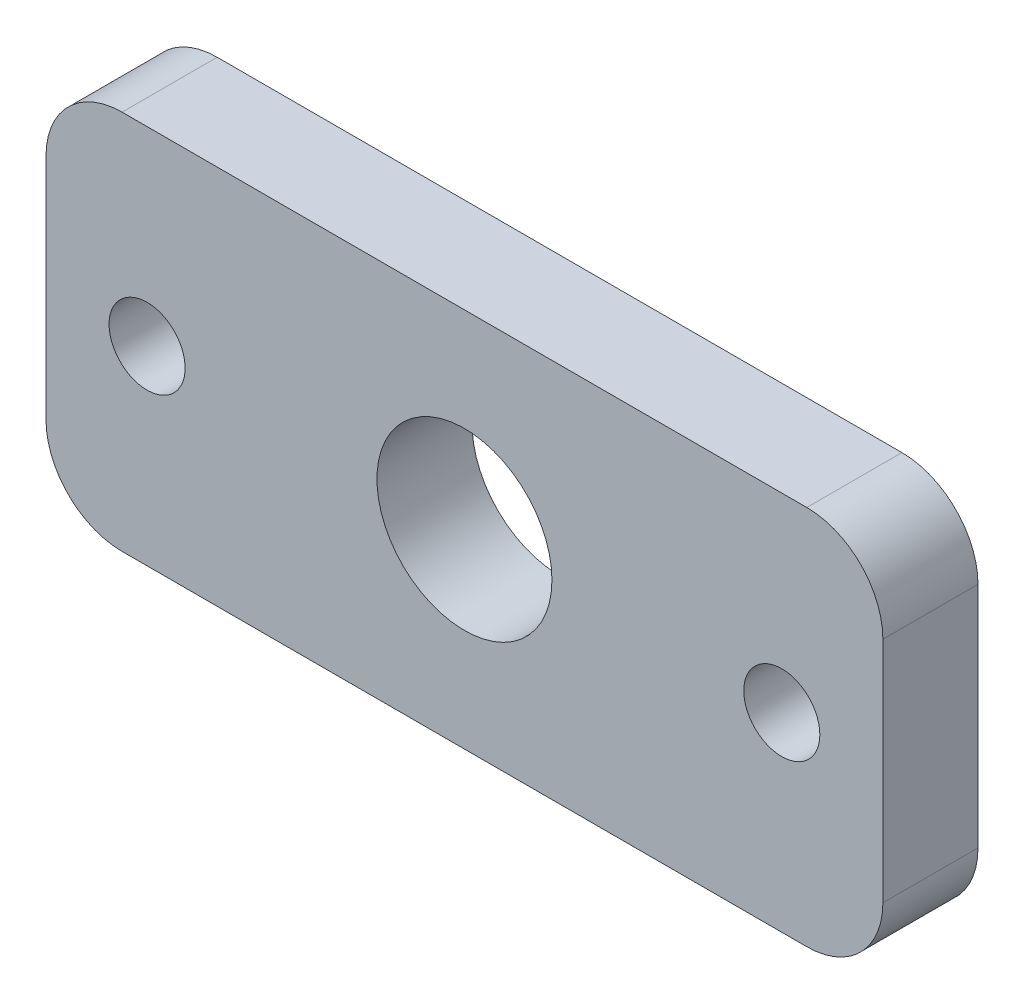
ISO-10303-21;
HEADER;
FILE_DESCRIPTION(('STEP AP214'),'2;1');
FILE_NAME('part.step','',(''),(''),'','','');
FILE_SCHEMA(('AUTOMOTIVE_DESIGN { 1 0 10303 214 1 1 1 1 }'));
ENDSEC;
DATA;
#1=APPLICATION_CONTEXT('core data for automotive mechanical design processes');
#2=APPLICATION_PROTOCOL_DEFINITION('international standard','automotive_design',2000,#1);
#3=PRODUCT_CONTEXT('',#1,'mechanical');
#4=PRODUCT('Part','Part','',(#3));
#5=PRODUCT_RELATED_PRODUCT_CATEGORY('part','',(#4));
#6=PRODUCT_DEFINITION_FORMATION('','',#4);
#7=PRODUCT_DEFINITION_CONTEXT('part definition',#1,'design');
#8=PRODUCT_DEFINITION('design','',#6,#7);
#9=PRODUCT_DEFINITION_SHAPE('','',#8);
#10=(LENGTH_UNIT() NAMED_UNIT(*) SI_UNIT(.MILLI.,.METRE.));
#11=(NAMED_UNIT(*) PLANE_ANGLE_UNIT() SI_UNIT($,.RADIAN.));
#12=(NAMED_UNIT(*) SI_UNIT($,.STERADIAN.) SOLID_ANGLE_UNIT());
#13=UNCERTAINTY_MEASURE_WITH_UNIT(LENGTH_MEASURE(1.E-05),#10,'distance_accuracy_value','');
#14=(GEOMETRIC_REPRESENTATION_CONTEXT(3) GLOBAL_UNCERTAINTY_ASSIGNED_CONTEXT((#13)) GLOBAL_UNIT_ASSIGNED_CONTEXT((#10,
#11,#12)) REPRESENTATION_CONTEXT('',''));
#15=CARTESIAN_POINT('',(0.,0.,0.));
#16=DIRECTION('',(0.,0.,1.));
#17=DIRECTION('',(1.,0.,0.));
#18=AXIS2_PLACEMENT_3D('',#15,#16,#17);
#19=CARTESIAN_POINT('',(0.,0.,3.175));
#20=DIRECTION('',(0.,0.,1.));
#21=DIRECTION('',(1.,0.,0.));
#22=AXIS2_PLACEMENT_3D('',#19,#20,#21);
#23=PLANE('',#22);
#24=CARTESIAN_POINT('',(-21.19,0.,3.175));
#25=DIRECTION('',(0.,0.,1.));
#26=DIRECTION('',(-1.,0.,0.));
#27=AXIS2_PLACEMENT_3D('',#24,#25,#26);
#28=CIRCLE('',#27,2.54);
#29=CARTESIAN_POINT('',(-23.73,0.,3.175));
#30=VERTEX_POINT('',#29);
#31=EDGE_CURVE('E184',#30,#30,#28,.T.);
#32=ORIENTED_EDGE('',*,*,#31,.F.);
#33=EDGE_LOOP('',(#32));
#34=FACE_BOUND('',#33,.T.);
#35=CARTESIAN_POINT('',(21.19,0.,3.175));
#36=DIRECTION('',(0.,0.,1.));
#37=DIRECTION('',(1.,0.,0.));
#38=AXIS2_PLACEMENT_3D('',#35,#36,#37);
#39=CIRCLE('',#38,2.54);
#40=CARTESIAN_POINT('',(23.73,0.,3.175));
#41=VERTEX_POINT('',#40);
#42=EDGE_CURVE('E178',#41,#41,#39,.T.);
#43=ORIENTED_EDGE('',*,*,#42,.F.);
#44=EDGE_LOOP('',(#43));
#45=FACE_BOUND('',#44,.T.);
#46=DIRECTION('',(0.,-1.,0.));
#47=VECTOR('',#46,1.);
#48=CARTESIAN_POINT('',(-27.94,12.7,3.175));
#49=LINE('',#48,#47);
#50=CARTESIAN_POINT('',(-27.94,7.62,3.175));
#51=VERTEX_POINT('',#50);
#52=CARTESIAN_POINT('',(-27.94,-7.62,3.175));
#53=VERTEX_POINT('',#52);
#54=EDGE_CURVE('E171',#51,#53,#49,.T.);
#55=ORIENTED_EDGE('',*,*,#54,.T.);
#56=CARTESIAN_POINT('',(-22.86,-7.62,3.175));
#57=DIRECTION('',(0.,0.,1.));
#58=DIRECTION('',(1.,0.,0.));
#59=AXIS2_PLACEMENT_3D('',#56,#57,#58);
#60=CIRCLE('',#59,5.08);
#61=CARTESIAN_POINT('',(-22.86,-12.7,3.175));
#62=VERTEX_POINT('',#61);
#63=EDGE_CURVE('E148',#53,#62,#60,.T.);
#64=ORIENTED_EDGE('',*,*,#63,.T.);
#65=DIRECTION('',(1.,0.,0.));
#66=VECTOR('',#65,1.);
#67=CARTESIAN_POINT('',(-27.94,-12.7,3.175));
#68=LINE('',#67,#66);
#69=CARTESIAN_POINT('',(22.86,-12.7,3.175));
#70=VERTEX_POINT('',#69);
#71=EDGE_CURVE('E119',#62,#70,#68,.T.);
#72=ORIENTED_EDGE('',*,*,#71,.T.);
#73=CARTESIAN_POINT('',(22.86,-7.62,3.175));
#74=DIRECTION('',(0.,0.,1.));
#75=DIRECTION('',(1.,0.,0.));
#76=AXIS2_PLACEMENT_3D('',#73,#74,#75);
#77=CIRCLE('',#76,5.08);
#78=CARTESIAN_POINT('',(27.94,-7.62,3.175));
#79=VERTEX_POINT('',#78);
#80=EDGE_CURVE('E146',#70,#79,#77,.T.);
#81=ORIENTED_EDGE('',*,*,#80,.T.);
#82=DIRECTION('',(0.,1.,0.));
#83=VECTOR('',#82,1.);
#84=CARTESIAN_POINT('',(27.94,12.7,3.175));
#85=LINE('',#84,#83);
#86=CARTESIAN_POINT('',(27.94,7.62,3.175));
#87=VERTEX_POINT('',#86);
#88=EDGE_CURVE('E126',#79,#87,#85,.T.);
#89=ORIENTED_EDGE('',*,*,#88,.T.);
#90=CARTESIAN_POINT('',(22.86,7.62,3.175));
#91=DIRECTION('',(0.,0.,1.));
#92=DIRECTION('',(1.,0.,0.));
#93=AXIS2_PLACEMENT_3D('',#90,#91,#92);
#94=CIRCLE('',#93,5.08);
#95=CARTESIAN_POINT('',(22.86,12.7,3.175));
#96=VERTEX_POINT('',#95);
#97=EDGE_CURVE('E54',#87,#96,#94,.T.);
#98=ORIENTED_EDGE('',*,*,#97,.T.);
#99=DIRECTION('',(-1.,0.,0.));
#100=VECTOR('',#99,1.);
#101=CARTESIAN_POINT('',(-27.94,12.7,3.175));
#102=LINE('',#101,#100);
#103=CARTESIAN_POINT('',(-22.86,12.7,3.175));
#104=VERTEX_POINT('',#103);
#105=EDGE_CURVE('E129',#96,#104,#102,.T.);
#106=ORIENTED_EDGE('',*,*,#105,.T.);
#107=CARTESIAN_POINT('',(-22.86,7.62,3.175));
#108=DIRECTION('',(0.,0.,1.));
#109=DIRECTION('',(1.,0.,0.));
#110=AXIS2_PLACEMENT_3D('',#107,#108,#109);
#111=CIRCLE('',#110,5.08);
#112=EDGE_CURVE('E143',#104,#51,#111,.T.);
#113=ORIENTED_EDGE('',*,*,#112,.T.);
#114=EDGE_LOOP('',(#55,#64,#72,#81,#89,#98,#106,#113));
#115=FACE_BOUND('',#114,.T.);
#116=CARTESIAN_POINT('',(0.,0.,3.175));
#117=DIRECTION('',(0.,0.,1.));
#118=DIRECTION('',(1.,0.,0.));
#119=AXIS2_PLACEMENT_3D('',#116,#117,#118);
#120=CIRCLE('',#119,5.842);
#121=CARTESIAN_POINT('',(5.842,0.,3.175));
#122=VERTEX_POINT('',#121);
#123=EDGE_CURVE('E164',#122,#122,#120,.T.);
#124=ORIENTED_EDGE('',*,*,#123,.F.);
#125=EDGE_LOOP('',(#124));
#126=FACE_BOUND('',#125,.T.);
#127=ADVANCED_FACE('F33',(#34,#45,#115,#126),#23,.T.);
#128=CARTESIAN_POINT('',(0.,0.,-3.175));
#129=DIRECTION('',(0.,0.,1.));
#130=DIRECTION('',(1.,0.,0.));
#131=AXIS2_PLACEMENT_3D('',#128,#129,#130);
#132=PLANE('',#131);
#133=CARTESIAN_POINT('',(-21.19,0.,-3.175));
#134=DIRECTION('',(0.,0.,1.));
#135=DIRECTION('',(-1.,0.,0.));
#136=AXIS2_PLACEMENT_3D('',#133,#134,#135);
#137=CIRCLE('',#136,2.54);
#138=CARTESIAN_POINT('',(-23.73,0.,-3.175));
#139=VERTEX_POINT('',#138);
#140=EDGE_CURVE('E181',#139,#139,#137,.T.);
#141=ORIENTED_EDGE('',*,*,#140,.T.);
#142=EDGE_LOOP('',(#141));
#143=FACE_BOUND('',#142,.T.);
#144=CARTESIAN_POINT('',(21.19,0.,-3.175));
#145=DIRECTION('',(0.,0.,1.));
#146=DIRECTION('',(1.,0.,0.));
#147=AXIS2_PLACEMENT_3D('',#144,#145,#146);
#148=CIRCLE('',#147,2.54);
#149=CARTESIAN_POINT('',(23.73,0.,-3.175));
#150=VERTEX_POINT('',#149);
#151=EDGE_CURVE('E176',#150,#150,#148,.T.);
#152=ORIENTED_EDGE('',*,*,#151,.T.);
#153=EDGE_LOOP('',(#152));
#154=FACE_BOUND('',#153,.T.);
#155=DIRECTION('',(1.,0.,0.));
#156=VECTOR('',#155,1.);
#157=CARTESIAN_POINT('',(-27.94,-12.7,-3.175));
#158=LINE('',#157,#156);
#159=CARTESIAN_POINT('',(-22.86,-12.7,-3.175));
#160=VERTEX_POINT('',#159);
#161=CARTESIAN_POINT('',(22.86,-12.7,-3.175));
#162=VERTEX_POINT('',#161);
#163=EDGE_CURVE('E116',#160,#162,#158,.T.);
#164=ORIENTED_EDGE('',*,*,#163,.F.);
#165=CARTESIAN_POINT('',(-22.86,-7.62,-3.175));
#166=DIRECTION('',(0.,0.,1.));
#167=DIRECTION('',(1.,0.,0.));
#168=AXIS2_PLACEMENT_3D('',#165,#166,#167);
#169=CIRCLE('',#168,5.08);
#170=CARTESIAN_POINT('',(-27.94,-7.62,-3.175));
#171=VERTEX_POINT('',#170);
#172=EDGE_CURVE('E99',#160,#171,#169,.F.);
#173=ORIENTED_EDGE('',*,*,#172,.T.);
#174=DIRECTION('',(0.,-1.,0.));
#175=VECTOR('',#174,1.);
#176=CARTESIAN_POINT('',(-27.94,12.7,-3.175));
#177=LINE('',#176,#175);
#178=CARTESIAN_POINT('',(-27.94,7.62,-3.175));
#179=VERTEX_POINT('',#178);
#180=EDGE_CURVE('E127',#179,#171,#177,.T.);
#181=ORIENTED_EDGE('',*,*,#180,.F.);
#182=CARTESIAN_POINT('',(-22.86,7.62,-3.175));
#183=DIRECTION('',(0.,0.,1.));
#184=DIRECTION('',(1.,0.,0.));
#185=AXIS2_PLACEMENT_3D('',#182,#183,#184);
#186=CIRCLE('',#185,5.08);
#187=CARTESIAN_POINT('',(-22.86,12.7,-3.175));
#188=VERTEX_POINT('',#187);
#189=EDGE_CURVE('E120',#179,#188,#186,.F.);
#190=ORIENTED_EDGE('',*,*,#189,.T.);
#191=DIRECTION('',(-1.,0.,0.));
#192=VECTOR('',#191,1.);
#193=CARTESIAN_POINT('',(-27.94,12.7,-3.175));
#194=LINE('',#193,#192);
#195=CARTESIAN_POINT('',(22.86,12.7,-3.175));
#196=VERTEX_POINT('',#195);
#197=EDGE_CURVE('E131',#196,#188,#194,.T.);
#198=ORIENTED_EDGE('',*,*,#197,.F.);
#199=CARTESIAN_POINT('',(22.86,7.62,-3.175));
#200=DIRECTION('',(0.,0.,1.));
#201=DIRECTION('',(1.,0.,0.));
#202=AXIS2_PLACEMENT_3D('',#199,#200,#201);
#203=CIRCLE('',#202,5.08);
#204=CARTESIAN_POINT('',(27.94,7.62,-3.175));
#205=VERTEX_POINT('',#204);
#206=EDGE_CURVE('E137',#196,#205,#203,.F.);
#207=ORIENTED_EDGE('',*,*,#206,.T.);
#208=DIRECTION('',(0.,1.,0.));
#209=VECTOR('',#208,1.);
#210=CARTESIAN_POINT('',(27.94,12.7,-3.175));
#211=LINE('',#210,#209);
#212=CARTESIAN_POINT('',(27.94,-7.62,-3.175));
#213=VERTEX_POINT('',#212);
#214=EDGE_CURVE('E159',#213,#205,#211,.T.);
#215=ORIENTED_EDGE('',*,*,#214,.F.);
#216=CARTESIAN_POINT('',(22.86,-7.62,-3.175));
#217=DIRECTION('',(0.,0.,1.));
#218=DIRECTION('',(1.,0.,0.));
#219=AXIS2_PLACEMENT_3D('',#216,#217,#218);
#220=CIRCLE('',#219,5.08);
#221=EDGE_CURVE('E110',#213,#162,#220,.F.);
#222=ORIENTED_EDGE('',*,*,#221,.T.);
#223=EDGE_LOOP('',(#164,#173,#181,#190,#198,#207,#215,#222));
#224=FACE_BOUND('',#223,.T.);
#225=CARTESIAN_POINT('',(0.,0.,-3.175));
#226=DIRECTION('',(0.,0.,1.));
#227=DIRECTION('',(1.,0.,0.));
#228=AXIS2_PLACEMENT_3D('',#225,#226,#227);
#229=CIRCLE('',#228,5.842);
#230=CARTESIAN_POINT('',(5.842,0.,-3.175));
#231=VERTEX_POINT('',#230);
#232=EDGE_CURVE('E167',#231,#231,#229,.T.);
#233=ORIENTED_EDGE('',*,*,#232,.T.);
#234=EDGE_LOOP('',(#233));
#235=FACE_BOUND('',#234,.T.);
#236=ADVANCED_FACE('F123',(#143,#154,#224,#235),#132,.F.);
#237=CARTESIAN_POINT('',(27.94,12.7,3.175));
#238=DIRECTION('',(-1.,0.,0.));
#239=DIRECTION('',(0.,-1.,0.));
#240=AXIS2_PLACEMENT_3D('',#237,#238,#239);
#241=PLANE('',#240);
#242=ORIENTED_EDGE('',*,*,#88,.F.);
#243=DIRECTION('',(0.,0.,-1.));
#244=VECTOR('',#243,1.);
#245=CARTESIAN_POINT('',(27.94,-7.62,3.175));
#246=LINE('',#245,#244);
#247=EDGE_CURVE('E152',#79,#213,#246,.T.);
#248=ORIENTED_EDGE('',*,*,#247,.T.);
#249=ORIENTED_EDGE('',*,*,#214,.T.);
#250=DIRECTION('',(0.,0.,-1.));
#251=VECTOR('',#250,1.);
#252=CARTESIAN_POINT('',(27.94,7.62,3.175));
#253=LINE('',#252,#251);
#254=EDGE_CURVE('E150',#205,#87,#253,.F.);
#255=ORIENTED_EDGE('',*,*,#254,.T.);
#256=EDGE_LOOP('',(#242,#248,#249,#255));
#257=FACE_BOUND('',#256,.T.);
#258=ADVANCED_FACE('F158',(#257),#241,.F.);
#259=CARTESIAN_POINT('',(-27.94,12.7,3.175));
#260=DIRECTION('',(0.,-1.,0.));
#261=DIRECTION('',(0.,0.,-1.));
#262=AXIS2_PLACEMENT_3D('',#259,#260,#261);
#263=PLANE('',#262);
#264=ORIENTED_EDGE('',*,*,#105,.F.);
#265=DIRECTION('',(0.,0.,-1.));
#266=VECTOR('',#265,1.);
#267=CARTESIAN_POINT('',(22.86,12.7,3.175));
#268=LINE('',#267,#266);
#269=EDGE_CURVE('E11',#96,#196,#268,.T.);
#270=ORIENTED_EDGE('',*,*,#269,.T.);
#271=ORIENTED_EDGE('',*,*,#197,.T.);
#272=DIRECTION('',(0.,0.,-1.));
#273=VECTOR('',#272,1.);
#274=CARTESIAN_POINT('',(-22.86,12.7,3.175));
#275=LINE('',#274,#273);
#276=EDGE_CURVE('E41',#188,#104,#275,.F.);
#277=ORIENTED_EDGE('',*,*,#276,.T.);
#278=EDGE_LOOP('',(#264,#270,#271,#277));
#279=FACE_BOUND('',#278,.T.);
#280=ADVANCED_FACE('F217',(#279),#263,.F.);
#281=CARTESIAN_POINT('',(-27.94,12.7,3.175));
#282=DIRECTION('',(1.,0.,0.));
#283=DIRECTION('',(0.,1.,0.));
#284=AXIS2_PLACEMENT_3D('',#281,#282,#283);
#285=PLANE('',#284);
#286=ORIENTED_EDGE('',*,*,#180,.T.);
#287=DIRECTION('',(0.,0.,-1.));
#288=VECTOR('',#287,1.);
#289=CARTESIAN_POINT('',(-27.94,-7.62,3.175));
#290=LINE('',#289,#288);
#291=EDGE_CURVE('E104',#171,#53,#290,.F.);
#292=ORIENTED_EDGE('',*,*,#291,.T.);
#293=ORIENTED_EDGE('',*,*,#54,.F.);
#294=DIRECTION('',(0.,0.,-1.));
#295=VECTOR('',#294,1.);
#296=CARTESIAN_POINT('',(-27.94,7.62,3.175));
#297=LINE('',#296,#295);
#298=EDGE_CURVE('E109',#51,#179,#297,.T.);
#299=ORIENTED_EDGE('',*,*,#298,.T.);
#300=EDGE_LOOP('',(#286,#292,#293,#299));
#301=FACE_BOUND('',#300,.T.);
#302=ADVANCED_FACE('F222',(#301),#285,.F.);
#303=CARTESIAN_POINT('',(-27.94,-12.7,3.175));
#304=DIRECTION('',(0.,1.,0.));
#305=DIRECTION('',(0.,0.,1.));
#306=AXIS2_PLACEMENT_3D('',#303,#304,#305);
#307=PLANE('',#306);
#308=ORIENTED_EDGE('',*,*,#71,.F.);
#309=DIRECTION('',(0.,0.,-1.));
#310=VECTOR('',#309,1.);
#311=CARTESIAN_POINT('',(-22.86,-12.7,3.175));
#312=LINE('',#311,#310);
#313=EDGE_CURVE('E103',#62,#160,#312,.T.);
#314=ORIENTED_EDGE('',*,*,#313,.T.);
#315=ORIENTED_EDGE('',*,*,#163,.T.);
#316=DIRECTION('',(0.,0.,-1.));
#317=VECTOR('',#316,1.);
#318=CARTESIAN_POINT('',(22.86,-12.7,3.175));
#319=LINE('',#318,#317);
#320=EDGE_CURVE('E121',#162,#70,#319,.F.);
#321=ORIENTED_EDGE('',*,*,#320,.T.);
#322=EDGE_LOOP('',(#308,#314,#315,#321));
#323=FACE_BOUND('',#322,.T.);
#324=ADVANCED_FACE('F115',(#323),#307,.F.);
#325=CARTESIAN_POINT('',(0.,0.,3.175));
#326=DIRECTION('',(0.,0.,-1.));
#327=DIRECTION('',(-1.,0.,0.));
#328=AXIS2_PLACEMENT_3D('',#325,#326,#327);
#329=CYLINDRICAL_SURFACE('',#328,5.842);
#330=ORIENTED_EDGE('',*,*,#123,.T.);
#331=EDGE_LOOP('',(#330));
#332=FACE_BOUND('',#331,.T.);
#333=ORIENTED_EDGE('',*,*,#232,.F.);
#334=EDGE_LOOP('',(#333));
#335=FACE_BOUND('',#334,.T.);
#336=ADVANCED_FACE('F207',(#332,#335),#329,.F.);
#337=CARTESIAN_POINT('',(21.19,0.,-3.175));
#338=DIRECTION('',(0.,0.,1.));
#339=DIRECTION('',(1.,0.,0.));
#340=AXIS2_PLACEMENT_3D('',#337,#338,#339);
#341=CYLINDRICAL_SURFACE('',#340,2.54);
#342=ORIENTED_EDGE('',*,*,#151,.F.);
#343=EDGE_LOOP('',(#342));
#344=FACE_BOUND('',#343,.T.);
#345=ORIENTED_EDGE('',*,*,#42,.T.);
#346=EDGE_LOOP('',(#345));
#347=FACE_BOUND('',#346,.T.);
#348=ADVANCED_FACE('F195',(#344,#347),#341,.F.);
#349=CARTESIAN_POINT('',(-21.19,0.,-3.175));
#350=DIRECTION('',(0.,0.,1.));
#351=DIRECTION('',(1.,0.,0.));
#352=AXIS2_PLACEMENT_3D('',#349,#350,#351);
#353=CYLINDRICAL_SURFACE('',#352,2.54);
#354=ORIENTED_EDGE('',*,*,#140,.F.);
#355=EDGE_LOOP('',(#354));
#356=FACE_BOUND('',#355,.T.);
#357=ORIENTED_EDGE('',*,*,#31,.T.);
#358=EDGE_LOOP('',(#357));
#359=FACE_BOUND('',#358,.T.);
#360=ADVANCED_FACE('F192',(#356,#359),#353,.F.);
#361=CARTESIAN_POINT('',(-22.86,-7.62,3.175));
#362=DIRECTION('',(0.,0.,-1.));
#363=DIRECTION('',(-1.,0.,0.));
#364=AXIS2_PLACEMENT_3D('',#361,#362,#363);
#365=CYLINDRICAL_SURFACE('',#364,5.08);
#366=ORIENTED_EDGE('',*,*,#63,.F.);
#367=ORIENTED_EDGE('',*,*,#291,.F.);
#368=ORIENTED_EDGE('',*,*,#172,.F.);
#369=ORIENTED_EDGE('',*,*,#313,.F.);
#370=EDGE_LOOP('',(#366,#367,#368,#369));
#371=FACE_BOUND('',#370,.T.);
#372=ADVANCED_FACE('F102',(#371),#365,.T.);
#373=CARTESIAN_POINT('',(22.86,-7.62,3.175));
#374=DIRECTION('',(0.,0.,-1.));
#375=DIRECTION('',(-1.,0.,0.));
#376=AXIS2_PLACEMENT_3D('',#373,#374,#375);
#377=CYLINDRICAL_SURFACE('',#376,5.08);
#378=ORIENTED_EDGE('',*,*,#80,.F.);
#379=ORIENTED_EDGE('',*,*,#320,.F.);
#380=ORIENTED_EDGE('',*,*,#221,.F.);
#381=ORIENTED_EDGE('',*,*,#247,.F.);
#382=EDGE_LOOP('',(#378,#379,#380,#381));
#383=FACE_BOUND('',#382,.T.);
#384=ADVANCED_FACE('F230',(#383),#377,.T.);
#385=CARTESIAN_POINT('',(22.86,7.62,3.175));
#386=DIRECTION('',(0.,0.,-1.));
#387=DIRECTION('',(-1.,0.,0.));
#388=AXIS2_PLACEMENT_3D('',#385,#386,#387);
#389=CYLINDRICAL_SURFACE('',#388,5.08);
#390=ORIENTED_EDGE('',*,*,#97,.F.);
#391=ORIENTED_EDGE('',*,*,#254,.F.);
#392=ORIENTED_EDGE('',*,*,#206,.F.);
#393=ORIENTED_EDGE('',*,*,#269,.F.);
#394=EDGE_LOOP('',(#390,#391,#392,#393));
#395=FACE_BOUND('',#394,.T.);
#396=ADVANCED_FACE('F232',(#395),#389,.T.);
#397=CARTESIAN_POINT('',(-22.86,7.62,3.175));
#398=DIRECTION('',(0.,0.,-1.));
#399=DIRECTION('',(-1.,0.,0.));
#400=AXIS2_PLACEMENT_3D('',#397,#398,#399);
#401=CYLINDRICAL_SURFACE('',#400,5.08);
#402=ORIENTED_EDGE('',*,*,#112,.F.);
#403=ORIENTED_EDGE('',*,*,#276,.F.);
#404=ORIENTED_EDGE('',*,*,#189,.F.);
#405=ORIENTED_EDGE('',*,*,#298,.F.);
#406=EDGE_LOOP('',(#402,#403,#404,#405));
#407=FACE_BOUND('',#406,.T.);
#408=ADVANCED_FACE('F35',(#407),#401,.T.);
#409=CLOSED_SHELL('',(#127,#236,#258,#280,#302,#324,#336,#348,#360,#372,#384,#396,#408));
#410=MANIFOLD_SOLID_BREP('B2',#409);
#411=ADVANCED_BREP_SHAPE_REPRESENTATION('',(#18,#410),#14);
#412=SHAPE_DEFINITION_REPRESENTATION(#9,#411);
ENDSEC;
END-ISO-10303-21;
